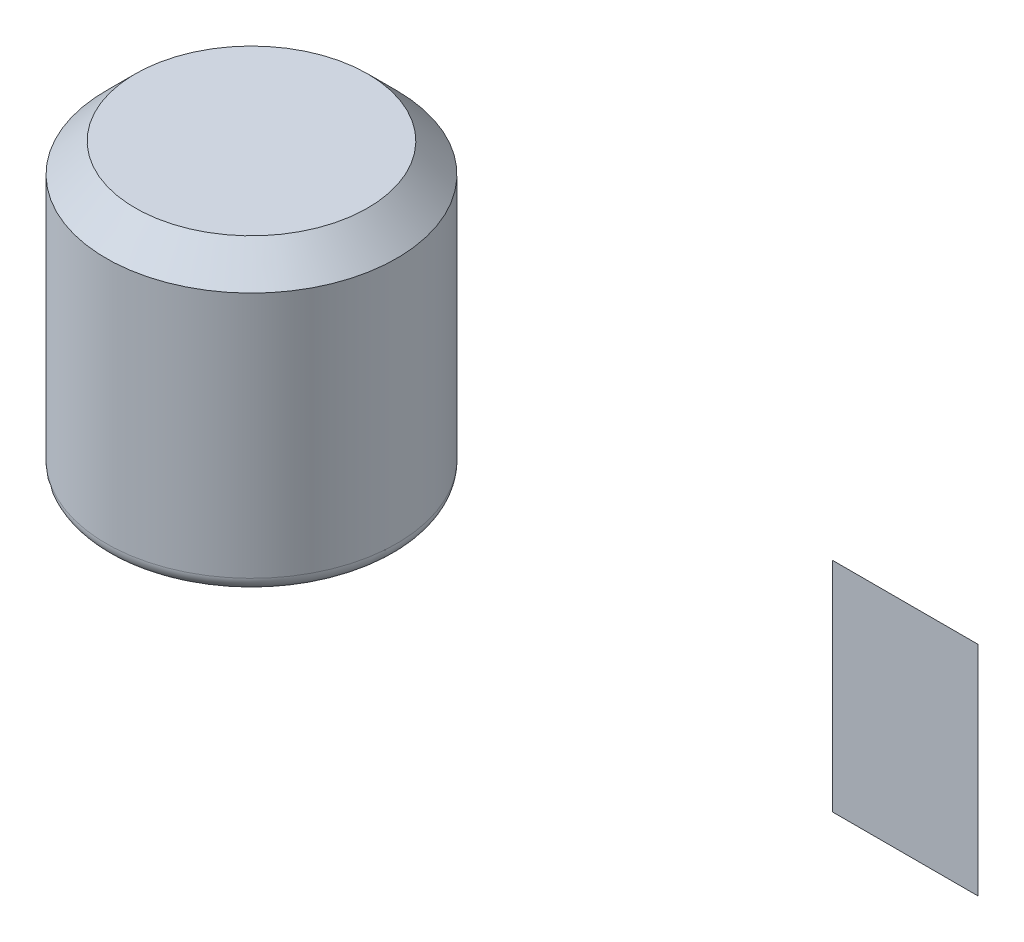
ISO-10303-21;
HEADER;
FILE_DESCRIPTION(('STEP AP214'),'2;1');
FILE_NAME('part.step','',(''),(''),'','','');
FILE_SCHEMA(('AUTOMOTIVE_DESIGN { 1 0 10303 214 1 1 1 1 }'));
ENDSEC;
DATA;
#1=APPLICATION_CONTEXT('core data for automotive mechanical design processes');
#2=APPLICATION_PROTOCOL_DEFINITION('international standard','automotive_design',2000,#1);
#3=PRODUCT_CONTEXT('',#1,'mechanical');
#4=PRODUCT('Part','Part','',(#3));
#5=PRODUCT_RELATED_PRODUCT_CATEGORY('part','',(#4));
#6=PRODUCT_DEFINITION_FORMATION('','',#4);
#7=PRODUCT_DEFINITION_CONTEXT('part definition',#1,'design');
#8=PRODUCT_DEFINITION('design','',#6,#7);
#9=PRODUCT_DEFINITION_SHAPE('','',#8);
#10=(LENGTH_UNIT() NAMED_UNIT(*) SI_UNIT(.MILLI.,.METRE.));
#11=(NAMED_UNIT(*) PLANE_ANGLE_UNIT() SI_UNIT($,.RADIAN.));
#12=(NAMED_UNIT(*) SI_UNIT($,.STERADIAN.) SOLID_ANGLE_UNIT());
#13=UNCERTAINTY_MEASURE_WITH_UNIT(LENGTH_MEASURE(1.E-05),#10,'distance_accuracy_value','');
#14=(GEOMETRIC_REPRESENTATION_CONTEXT(3) GLOBAL_UNCERTAINTY_ASSIGNED_CONTEXT((#13)) GLOBAL_UNIT_ASSIGNED_CONTEXT((#10,
#11,#12)) REPRESENTATION_CONTEXT('',''));
#15=CARTESIAN_POINT('',(0.,0.,0.));
#16=DIRECTION('',(0.,0.,1.));
#17=DIRECTION('',(1.,0.,0.));
#18=AXIS2_PLACEMENT_3D('',#15,#16,#17);
#19=CARTESIAN_POINT('',(0.,0.,0.));
#20=DIRECTION('',(0.,-1.,0.));
#21=DIRECTION('',(0.,0.,-1.));
#22=AXIS2_PLACEMENT_3D('',#19,#20,#21);
#23=PLANE('',#22);
#24=CARTESIAN_POINT('',(0.,0.,0.));
#25=DIRECTION('',(0.,-1.,0.));
#26=DIRECTION('',(0.,0.,-1.));
#27=AXIS2_PLACEMENT_3D('',#24,#25,#26);
#28=CIRCLE('',#27,9.);
#29=CARTESIAN_POINT('',(0.,0.,-9.));
#30=VERTEX_POINT('',#29);
#31=EDGE_CURVE('P0_E47',#30,#30,#28,.T.);
#32=ORIENTED_EDGE('',*,*,#31,.T.);
#33=EDGE_LOOP('',(#32));
#34=FACE_BOUND('',#33,.T.);
#35=ADVANCED_FACE('P0_F40',(#34),#23,.T.);
#36=CARTESIAN_POINT('',(0.,-10.,0.));
#37=DIRECTION('',(0.,-1.,0.));
#38=DIRECTION('',(0.,0.,-1.));
#39=AXIS2_PLACEMENT_3D('',#36,#37,#38);
#40=CYLINDRICAL_SURFACE('',#39,10.);
#41=CARTESIAN_POINT('',(0.,0.999999999999999,0.));
#42=DIRECTION('',(0.,-1.,0.));
#43=DIRECTION('',(0.,0.,-1.));
#44=AXIS2_PLACEMENT_3D('',#41,#42,#43);
#45=CIRCLE('',#44,10.);
#46=CARTESIAN_POINT('',(0.,0.999999999999999,-10.));
#47=VERTEX_POINT('',#46);
#48=EDGE_CURVE('P0_E10',#47,#47,#45,.F.);
#49=ORIENTED_EDGE('',*,*,#48,.T.);
#50=EDGE_LOOP('',(#49));
#51=FACE_BOUND('',#50,.T.);
#52=CARTESIAN_POINT('',(0.,18.,0.));
#53=DIRECTION('',(0.,-1.,0.));
#54=DIRECTION('',(0.,0.,-1.));
#55=AXIS2_PLACEMENT_3D('',#52,#53,#54);
#56=CIRCLE('',#55,10.);
#57=CARTESIAN_POINT('',(0.,18.,-10.));
#58=VERTEX_POINT('',#57);
#59=EDGE_CURVE('P0_E51',#58,#58,#56,.T.);
#60=ORIENTED_EDGE('',*,*,#59,.T.);
#61=EDGE_LOOP('',(#60));
#62=FACE_BOUND('',#61,.T.);
#63=ADVANCED_FACE('P0_F73',(#51,#62),#40,.T.);
#64=CARTESIAN_POINT('',(0.,18.,0.));
#65=DIRECTION('',(0.,-1.,0.));
#66=DIRECTION('',(0.,0.,-1.));
#67=AXIS2_PLACEMENT_3D('',#64,#65,#66);
#68=CONICAL_SURFACE('',#67,10.,0.785398163397448);
#69=CARTESIAN_POINT('',(0.,20.,0.));
#70=DIRECTION('',(0.,-1.,0.));
#71=DIRECTION('',(0.,0.,-1.));
#72=AXIS2_PLACEMENT_3D('',#69,#70,#71);
#73=CIRCLE('',#72,8.);
#74=CARTESIAN_POINT('',(0.,20.,-8.));
#75=VERTEX_POINT('',#74);
#76=EDGE_CURVE('P0_E55',#75,#75,#73,.T.);
#77=ORIENTED_EDGE('',*,*,#76,.T.);
#78=EDGE_LOOP('',(#77));
#79=FACE_BOUND('',#78,.T.);
#80=ORIENTED_EDGE('',*,*,#59,.F.);
#81=EDGE_LOOP('',(#80));
#82=FACE_BOUND('',#81,.T.);
#83=ADVANCED_FACE('P0_F61',(#79,#82),#68,.T.);
#84=CARTESIAN_POINT('',(8.,20.,0.));
#85=DIRECTION('',(0.,1.,0.));
#86=DIRECTION('',(0.,0.,1.));
#87=AXIS2_PLACEMENT_3D('',#84,#85,#86);
#88=PLANE('',#87);
#89=ORIENTED_EDGE('',*,*,#76,.F.);
#90=EDGE_LOOP('',(#89));
#91=FACE_BOUND('',#90,.T.);
#92=ADVANCED_FACE('P0_F64',(#91),#88,.T.);
#93=CARTESIAN_POINT('',(0.,0.999999999999999,0.));
#94=DIRECTION('',(0.,-1.,0.));
#95=DIRECTION('',(0.,0.,-1.));
#96=AXIS2_PLACEMENT_3D('',#93,#94,#95);
#97=TOROIDAL_SURFACE('',#96,9.,1.);
#98=ORIENTED_EDGE('',*,*,#48,.F.);
#99=EDGE_LOOP('',(#98));
#100=FACE_BOUND('',#99,.T.);
#101=ORIENTED_EDGE('',*,*,#31,.F.);
#102=EDGE_LOOP('',(#101));
#103=FACE_BOUND('',#102,.T.);
#104=ADVANCED_FACE('P0_F42',(#100,#103),#97,.T.);
#105=CLOSED_SHELL('',(#35,#63,#83,#92,#104));
#106=MANIFOLD_SOLID_BREP('P0_B2',#105);
#107=CARTESIAN_POINT('',(40.,0.,0.));
#108=DIRECTION('',(0.,0.,1.));
#109=DIRECTION('',(1.,0.,0.));
#110=AXIS2_PLACEMENT_3D('',#107,#108,#109);
#111=PLANE('',#110);
#112=DIRECTION('',(1.,0.,0.));
#113=VECTOR('',#112,1.);
#114=CARTESIAN_POINT('',(40.,0.,0.));
#115=LINE('',#114,#113);
#116=CARTESIAN_POINT('',(40.,0.,0.));
#117=VERTEX_POINT('',#116);
#118=CARTESIAN_POINT('',(50.,0.,0.));
#119=VERTEX_POINT('',#118);
#120=EDGE_CURVE('P1_E9',#117,#119,#115,.T.);
#121=ORIENTED_EDGE('',*,*,#120,.T.);
#122=DIRECTION('',(0.,1.,0.));
#123=VECTOR('',#122,1.);
#124=CARTESIAN_POINT('',(50.,0.,0.));
#125=LINE('',#124,#123);
#126=CARTESIAN_POINT('',(50.,15.,0.));
#127=VERTEX_POINT('',#126);
#128=EDGE_CURVE('P1_E22',#119,#127,#125,.T.);
#129=ORIENTED_EDGE('',*,*,#128,.T.);
#130=DIRECTION('',(1.,0.,0.));
#131=VECTOR('',#130,1.);
#132=CARTESIAN_POINT('',(40.,15.,0.));
#133=LINE('',#132,#131);
#134=CARTESIAN_POINT('',(40.,15.,0.));
#135=VERTEX_POINT('',#134);
#136=EDGE_CURVE('P1_E30',#127,#135,#133,.F.);
#137=ORIENTED_EDGE('',*,*,#136,.T.);
#138=DIRECTION('',(0.,1.,0.));
#139=VECTOR('',#138,1.);
#140=CARTESIAN_POINT('',(40.,0.,0.));
#141=LINE('',#140,#139);
#142=EDGE_CURVE('P1_E16',#135,#117,#141,.F.);
#143=ORIENTED_EDGE('',*,*,#142,.T.);
#144=EDGE_LOOP('',(#121,#129,#137,#143));
#145=FACE_BOUND('',#144,.T.);
#146=ADVANCED_FACE('P1_F15',(#145),#111,.T.);
#147=OPEN_SHELL('',(#146));
#148=SHELL_BASED_SURFACE_MODEL('P1_B1',(#147));
#149=ADVANCED_BREP_SHAPE_REPRESENTATION('',(#18,#106),#14);
#150=MANIFOLD_SURFACE_SHAPE_REPRESENTATION('',(#18,#148),#14);
#151=SHAPE_REPRESENTATION('',(#18),#14);
#152=SHAPE_DEFINITION_REPRESENTATION(#9,#151);
#153=SHAPE_REPRESENTATION_RELATIONSHIP('','',#151,#149);
#154=SHAPE_REPRESENTATION_RELATIONSHIP('','',#151,#150);
ENDSEC;
END-ISO-10303-21;
